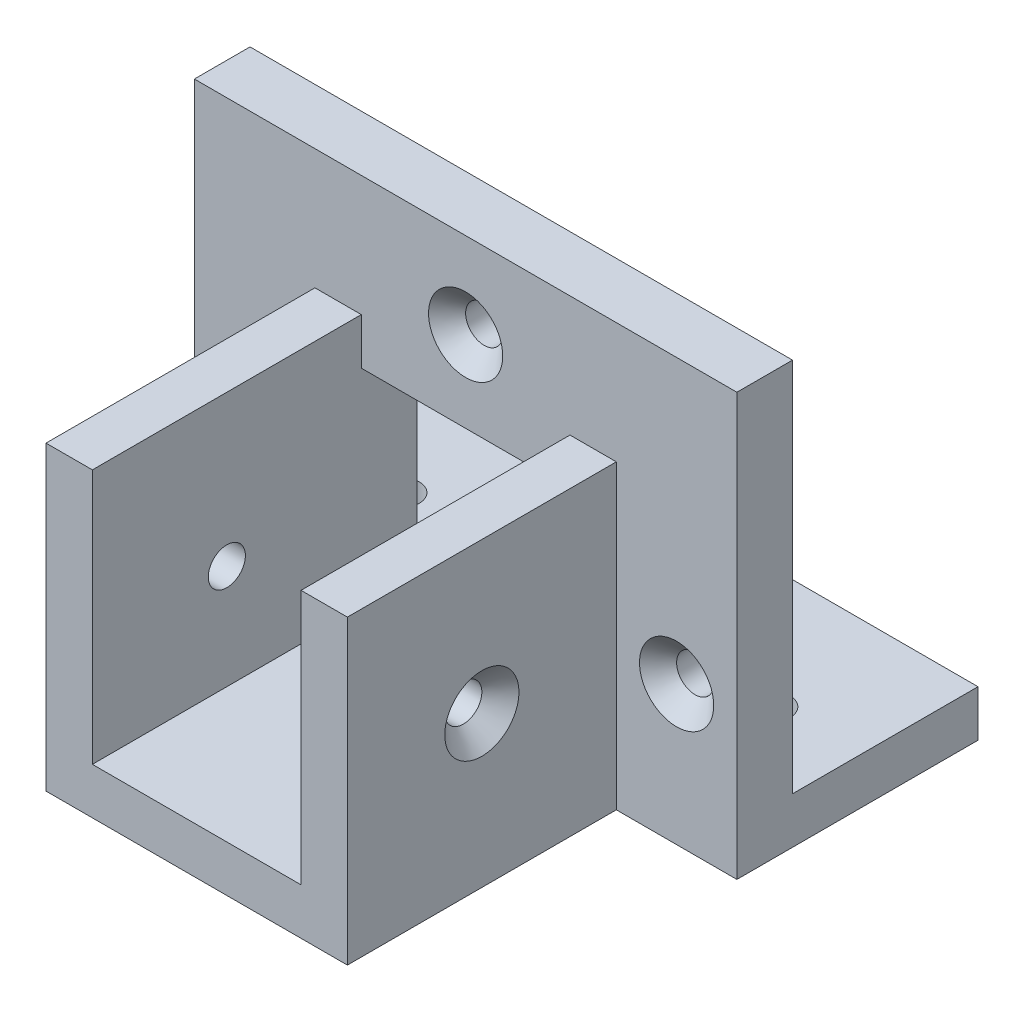
ISO-10303-21;
HEADER;
FILE_DESCRIPTION(('STEP AP214'),'2;1');
FILE_NAME('part.step','',(''),(''),'','','');
FILE_SCHEMA(('AUTOMOTIVE_DESIGN { 1 0 10303 214 1 1 1 1 }'));
ENDSEC;
DATA;
#1=APPLICATION_CONTEXT('core data for automotive mechanical design processes');
#2=APPLICATION_PROTOCOL_DEFINITION('international standard','automotive_design',2000,#1);
#3=PRODUCT_CONTEXT('',#1,'mechanical');
#4=PRODUCT('Part','Part','',(#3));
#5=PRODUCT_RELATED_PRODUCT_CATEGORY('part','',(#4));
#6=PRODUCT_DEFINITION_FORMATION('','',#4);
#7=PRODUCT_DEFINITION_CONTEXT('part definition',#1,'design');
#8=PRODUCT_DEFINITION('design','',#6,#7);
#9=PRODUCT_DEFINITION_SHAPE('','',#8);
#10=(LENGTH_UNIT() NAMED_UNIT(*) SI_UNIT(.MILLI.,.METRE.));
#11=(NAMED_UNIT(*) PLANE_ANGLE_UNIT() SI_UNIT($,.RADIAN.));
#12=(NAMED_UNIT(*) SI_UNIT($,.STERADIAN.) SOLID_ANGLE_UNIT());
#13=UNCERTAINTY_MEASURE_WITH_UNIT(LENGTH_MEASURE(1.E-05),#10,'distance_accuracy_value','');
#14=(GEOMETRIC_REPRESENTATION_CONTEXT(3) GLOBAL_UNCERTAINTY_ASSIGNED_CONTEXT((#13)) GLOBAL_UNIT_ASSIGNED_CONTEXT((#10,
#11,#12)) REPRESENTATION_CONTEXT('',''));
#15=CARTESIAN_POINT('',(0.,0.,0.));
#16=DIRECTION('',(0.,0.,1.));
#17=DIRECTION('',(1.,0.,0.));
#18=AXIS2_PLACEMENT_3D('',#15,#16,#17);
#19=CARTESIAN_POINT('',(-16.25,16.25,35.));
#20=DIRECTION('',(0.,-1.,0.));
#21=DIRECTION('',(0.,0.,-1.));
#22=AXIS2_PLACEMENT_3D('',#19,#20,#21);
#23=PLANE('',#22);
#24=DIRECTION('',(-1.,0.,0.));
#25=VECTOR('',#24,1.);
#26=CARTESIAN_POINT('',(-16.25,16.25,35.));
#27=LINE('',#26,#25);
#28=CARTESIAN_POINT('',(-11.25,16.25,35.));
#29=VERTEX_POINT('',#28);
#30=CARTESIAN_POINT('',(-16.25,16.25,35.));
#31=VERTEX_POINT('',#30);
#32=EDGE_CURVE('E308',#29,#31,#27,.T.);
#33=ORIENTED_EDGE('',*,*,#32,.F.);
#34=DIRECTION('',(0.,0.,1.));
#35=VECTOR('',#34,1.);
#36=CARTESIAN_POINT('',(-11.25,16.25,-17.0488611432322));
#37=LINE('',#36,#35);
#38=CARTESIAN_POINT('',(-11.25,16.25,6.));
#39=VERTEX_POINT('',#38);
#40=EDGE_CURVE('E188',#39,#29,#37,.T.);
#41=ORIENTED_EDGE('',*,*,#40,.F.);
#42=DIRECTION('',(-1.,0.,0.));
#43=VECTOR('',#42,1.);
#44=CARTESIAN_POINT('',(16.25,16.25,6.));
#45=LINE('',#44,#43);
#46=CARTESIAN_POINT('',(-16.25,16.25,6.));
#47=VERTEX_POINT('',#46);
#48=EDGE_CURVE('E222',#39,#47,#45,.T.);
#49=ORIENTED_EDGE('',*,*,#48,.T.);
#50=DIRECTION('',(0.,0.,-1.));
#51=VECTOR('',#50,1.);
#52=CARTESIAN_POINT('',(-16.25,16.25,35.));
#53=LINE('',#52,#51);
#54=EDGE_CURVE('E327',#31,#47,#53,.T.);
#55=ORIENTED_EDGE('',*,*,#54,.F.);
#56=EDGE_LOOP('',(#33,#41,#49,#55));
#57=FACE_BOUND('',#56,.T.);
#58=ADVANCED_FACE('F41',(#57),#23,.F.);
#59=CARTESIAN_POINT('',(-11.25,11.25,35.));
#60=DIRECTION('',(0.,-1.,0.));
#61=DIRECTION('',(0.,0.,-1.));
#62=AXIS2_PLACEMENT_3D('',#59,#60,#61);
#63=PLANE('',#62);
#64=DIRECTION('',(0.,0.,-1.));
#65=VECTOR('',#64,1.);
#66=CARTESIAN_POINT('',(11.25,11.25,35.));
#67=LINE('',#66,#65);
#68=CARTESIAN_POINT('',(11.25,11.25,5.99999999999999));
#69=VERTEX_POINT('',#68);
#70=CARTESIAN_POINT('',(11.25,11.25,0.));
#71=VERTEX_POINT('',#70);
#72=EDGE_CURVE('E295',#69,#71,#67,.T.);
#73=ORIENTED_EDGE('',*,*,#72,.F.);
#74=DIRECTION('',(-1.,0.,0.));
#75=VECTOR('',#74,1.);
#76=CARTESIAN_POINT('',(-11.25,11.25,6.));
#77=LINE('',#76,#75);
#78=CARTESIAN_POINT('',(-11.25,11.25,6.));
#79=VERTEX_POINT('',#78);
#80=EDGE_CURVE('E199',#69,#79,#77,.T.);
#81=ORIENTED_EDGE('',*,*,#80,.T.);
#82=DIRECTION('',(0.,0.,-1.));
#83=VECTOR('',#82,1.);
#84=CARTESIAN_POINT('',(-11.25,11.25,35.));
#85=LINE('',#84,#83);
#86=CARTESIAN_POINT('',(-11.25,11.25,0.));
#87=VERTEX_POINT('',#86);
#88=EDGE_CURVE('E283',#79,#87,#85,.T.);
#89=ORIENTED_EDGE('',*,*,#88,.T.);
#90=DIRECTION('',(-1.,0.,0.));
#91=VECTOR('',#90,1.);
#92=CARTESIAN_POINT('',(-11.25,11.25,0.));
#93=LINE('',#92,#91);
#94=EDGE_CURVE('E277',#71,#87,#93,.T.);
#95=ORIENTED_EDGE('',*,*,#94,.F.);
#96=EDGE_LOOP('',(#73,#81,#89,#95));
#97=FACE_BOUND('',#96,.T.);
#98=ADVANCED_FACE('F430',(#97),#63,.T.);
#99=CARTESIAN_POINT('',(0.,0.,35.));
#100=DIRECTION('',(0.,0.,-1.));
#101=DIRECTION('',(-1.,0.,0.));
#102=AXIS2_PLACEMENT_3D('',#99,#100,#101);
#103=PLANE('',#102);
#104=DIRECTION('',(0.,-1.,0.));
#105=VECTOR('',#104,1.);
#106=CARTESIAN_POINT('',(-11.25,-11.25,35.));
#107=LINE('',#106,#105);
#108=CARTESIAN_POINT('',(-11.25,-11.25,35.));
#109=VERTEX_POINT('',#108);
#110=EDGE_CURVE('E273',#29,#109,#107,.T.);
#111=ORIENTED_EDGE('',*,*,#110,.F.);
#112=ORIENTED_EDGE('',*,*,#32,.T.);
#113=DIRECTION('',(0.,-1.,0.));
#114=VECTOR('',#113,1.);
#115=CARTESIAN_POINT('',(-16.25,-16.25,35.));
#116=LINE('',#115,#114);
#117=CARTESIAN_POINT('',(-16.25,-16.25,35.));
#118=VERTEX_POINT('',#117);
#119=EDGE_CURVE('E313',#31,#118,#116,.T.);
#120=ORIENTED_EDGE('',*,*,#119,.T.);
#121=DIRECTION('',(1.,0.,0.));
#122=VECTOR('',#121,1.);
#123=CARTESIAN_POINT('',(-16.25,-16.25,35.));
#124=LINE('',#123,#122);
#125=CARTESIAN_POINT('',(16.25,-16.25,35.));
#126=VERTEX_POINT('',#125);
#127=EDGE_CURVE('E316',#118,#126,#124,.T.);
#128=ORIENTED_EDGE('',*,*,#127,.T.);
#129=DIRECTION('',(0.,1.,0.));
#130=VECTOR('',#129,1.);
#131=CARTESIAN_POINT('',(16.25,-16.25,35.));
#132=LINE('',#131,#130);
#133=CARTESIAN_POINT('',(16.25,16.25,35.));
#134=VERTEX_POINT('',#133);
#135=EDGE_CURVE('E304',#126,#134,#132,.T.);
#136=ORIENTED_EDGE('',*,*,#135,.T.);
#137=CARTESIAN_POINT('',(11.25,16.25,35.));
#138=VERTEX_POINT('',#137);
#139=EDGE_CURVE('E309',#134,#138,#27,.T.);
#140=ORIENTED_EDGE('',*,*,#139,.T.);
#141=DIRECTION('',(0.,1.,0.));
#142=VECTOR('',#141,1.);
#143=CARTESIAN_POINT('',(11.25,-11.25,35.));
#144=LINE('',#143,#142);
#145=CARTESIAN_POINT('',(11.25,-11.25,35.));
#146=VERTEX_POINT('',#145);
#147=EDGE_CURVE('E280',#146,#138,#144,.T.);
#148=ORIENTED_EDGE('',*,*,#147,.F.);
#149=DIRECTION('',(1.,0.,0.));
#150=VECTOR('',#149,1.);
#151=CARTESIAN_POINT('',(-11.25,-11.25,35.));
#152=LINE('',#151,#150);
#153=EDGE_CURVE('E276',#109,#146,#152,.T.);
#154=ORIENTED_EDGE('',*,*,#153,.F.);
#155=EDGE_LOOP('',(#111,#112,#120,#128,#136,#140,#148,#154));
#156=FACE_BOUND('',#155,.T.);
#157=ADVANCED_FACE('F437',(#156),#103,.F.);
#158=CARTESIAN_POINT('',(0.,0.,0.));
#159=DIRECTION('',(0.,0.,-1.));
#160=DIRECTION('',(-1.,0.,0.));
#161=AXIS2_PLACEMENT_3D('',#158,#159,#160);
#162=PLANE('',#161);
#163=DIRECTION('',(1.,0.,0.));
#164=VECTOR('',#163,1.);
#165=CARTESIAN_POINT('',(-29.25,-11.25,0.));
#166=LINE('',#165,#164);
#167=CARTESIAN_POINT('',(-29.25,-11.25,0.));
#168=VERTEX_POINT('',#167);
#169=CARTESIAN_POINT('',(-11.25,-11.25,0.));
#170=VERTEX_POINT('',#169);
#171=EDGE_CURVE('E58',#168,#170,#166,.T.);
#172=ORIENTED_EDGE('',*,*,#171,.F.);
#173=DIRECTION('',(0.,1.,0.));
#174=VECTOR('',#173,1.);
#175=CARTESIAN_POINT('',(-29.25,29.25,0.));
#176=LINE('',#175,#174);
#177=CARTESIAN_POINT('',(-29.25,29.25,0.));
#178=VERTEX_POINT('',#177);
#179=EDGE_CURVE('E183',#168,#178,#176,.T.);
#180=ORIENTED_EDGE('',*,*,#179,.T.);
#181=DIRECTION('',(1.,0.,0.));
#182=VECTOR('',#181,1.);
#183=CARTESIAN_POINT('',(29.25,29.25,0.));
#184=LINE('',#183,#182);
#185=CARTESIAN_POINT('',(29.25,29.25,0.));
#186=VERTEX_POINT('',#185);
#187=EDGE_CURVE('E255',#178,#186,#184,.T.);
#188=ORIENTED_EDGE('',*,*,#187,.T.);
#189=DIRECTION('',(0.,-1.,0.));
#190=VECTOR('',#189,1.);
#191=CARTESIAN_POINT('',(29.25,-16.25,0.));
#192=LINE('',#191,#190);
#193=CARTESIAN_POINT('',(29.25,-11.25,0.));
#194=VERTEX_POINT('',#193);
#195=EDGE_CURVE('E223',#186,#194,#192,.T.);
#196=ORIENTED_EDGE('',*,*,#195,.T.);
#197=CARTESIAN_POINT('',(11.25,-11.25,0.));
#198=VERTEX_POINT('',#197);
#199=EDGE_CURVE('E335',#198,#194,#166,.T.);
#200=ORIENTED_EDGE('',*,*,#199,.F.);
#201=DIRECTION('',(0.,1.,0.));
#202=VECTOR('',#201,1.);
#203=CARTESIAN_POINT('',(11.25,-11.25,0.));
#204=LINE('',#203,#202);
#205=EDGE_CURVE('E286',#198,#71,#204,.T.);
#206=ORIENTED_EDGE('',*,*,#205,.T.);
#207=ORIENTED_EDGE('',*,*,#94,.T.);
#208=DIRECTION('',(0.,-1.,0.));
#209=VECTOR('',#208,1.);
#210=CARTESIAN_POINT('',(-11.25,-11.25,0.));
#211=LINE('',#210,#209);
#212=EDGE_CURVE('E264',#87,#170,#211,.T.);
#213=ORIENTED_EDGE('',*,*,#212,.T.);
#214=EDGE_LOOP('',(#172,#180,#188,#196,#200,#206,#207,#213));
#215=FACE_BOUND('',#214,.T.);
#216=CARTESIAN_POINT('',(-22.75,-1.25000000000001,0.));
#217=DIRECTION('',(0.,0.,1.));
#218=DIRECTION('',(1.,0.,0.));
#219=AXIS2_PLACEMENT_3D('',#216,#217,#218);
#220=CIRCLE('',#219,2.);
#221=CARTESIAN_POINT('',(-20.75,-1.25000000000001,0.));
#222=VERTEX_POINT('',#221);
#223=EDGE_CURVE('E207',#222,#222,#220,.T.);
#224=ORIENTED_EDGE('',*,*,#223,.T.);
#225=EDGE_LOOP('',(#224));
#226=FACE_BOUND('',#225,.T.);
#227=CARTESIAN_POINT('',(0.,20.,0.));
#228=DIRECTION('',(0.,0.,1.));
#229=DIRECTION('',(1.,0.,0.));
#230=AXIS2_PLACEMENT_3D('',#227,#228,#229);
#231=CIRCLE('',#230,2.);
#232=CARTESIAN_POINT('',(2.,20.,0.));
#233=VERTEX_POINT('',#232);
#234=EDGE_CURVE('E211',#233,#233,#231,.T.);
#235=ORIENTED_EDGE('',*,*,#234,.T.);
#236=EDGE_LOOP('',(#235));
#237=FACE_BOUND('',#236,.T.);
#238=CARTESIAN_POINT('',(22.75,-1.25,0.));
#239=DIRECTION('',(0.,0.,1.));
#240=DIRECTION('',(1.,0.,0.));
#241=AXIS2_PLACEMENT_3D('',#238,#239,#240);
#242=CIRCLE('',#241,2.);
#243=CARTESIAN_POINT('',(24.75,-1.25,0.));
#244=VERTEX_POINT('',#243);
#245=EDGE_CURVE('E206',#244,#244,#242,.T.);
#246=ORIENTED_EDGE('',*,*,#245,.T.);
#247=EDGE_LOOP('',(#246));
#248=FACE_BOUND('',#247,.T.);
#249=ADVANCED_FACE('F453',(#215,#226,#237,#248),#162,.T.);
#250=CARTESIAN_POINT('',(16.25,-16.25,35.));
#251=DIRECTION('',(-1.,0.,0.));
#252=DIRECTION('',(0.,0.,1.));
#253=AXIS2_PLACEMENT_3D('',#250,#251,#252);
#254=PLANE('',#253);
#255=CARTESIAN_POINT('',(16.25,0.,20.5));
#256=DIRECTION('',(-1.,0.,0.));
#257=DIRECTION('',(0.,0.,1.));
#258=AXIS2_PLACEMENT_3D('',#255,#256,#257);
#259=CIRCLE('',#258,4.00000000000002);
#260=CARTESIAN_POINT('',(16.25,0.,24.5));
#261=VERTEX_POINT('',#260);
#262=EDGE_CURVE('E365',#261,#261,#259,.T.);
#263=ORIENTED_EDGE('',*,*,#262,.T.);
#264=EDGE_LOOP('',(#263));
#265=FACE_BOUND('',#264,.T.);
#266=DIRECTION('',(0.,0.,-1.));
#267=VECTOR('',#266,1.);
#268=CARTESIAN_POINT('',(16.25,-16.25,35.));
#269=LINE('',#268,#267);
#270=CARTESIAN_POINT('',(16.25,-16.25,6.));
#271=VERTEX_POINT('',#270);
#272=EDGE_CURVE('E319',#126,#271,#269,.T.);
#273=ORIENTED_EDGE('',*,*,#272,.T.);
#274=DIRECTION('',(0.,1.,0.));
#275=VECTOR('',#274,1.);
#276=CARTESIAN_POINT('',(16.25,-16.25,6.));
#277=LINE('',#276,#275);
#278=CARTESIAN_POINT('',(16.25,16.25,6.));
#279=VERTEX_POINT('',#278);
#280=EDGE_CURVE('E218',#271,#279,#277,.T.);
#281=ORIENTED_EDGE('',*,*,#280,.T.);
#282=DIRECTION('',(0.,0.,-1.));
#283=VECTOR('',#282,1.);
#284=CARTESIAN_POINT('',(16.25,16.25,35.));
#285=LINE('',#284,#283);
#286=EDGE_CURVE('E331',#134,#279,#285,.T.);
#287=ORIENTED_EDGE('',*,*,#286,.F.);
#288=ORIENTED_EDGE('',*,*,#135,.F.);
#289=EDGE_LOOP('',(#273,#281,#287,#288));
#290=FACE_BOUND('',#289,.T.);
#291=ADVANCED_FACE('F445',(#265,#290),#254,.F.);
#292=CARTESIAN_POINT('',(11.25,16.25,6.));
#293=VERTEX_POINT('',#292);
#294=EDGE_CURVE('E224',#279,#293,#45,.T.);
#295=ORIENTED_EDGE('',*,*,#294,.T.);
#296=DIRECTION('',(0.,0.,1.));
#297=VECTOR('',#296,1.);
#298=CARTESIAN_POINT('',(11.25,16.25,-17.0488611432322));
#299=LINE('',#298,#297);
#300=EDGE_CURVE('E66',#293,#138,#299,.T.);
#301=ORIENTED_EDGE('',*,*,#300,.T.);
#302=ORIENTED_EDGE('',*,*,#139,.F.);
#303=ORIENTED_EDGE('',*,*,#286,.T.);
#304=EDGE_LOOP('',(#295,#301,#302,#303));
#305=FACE_BOUND('',#304,.T.);
#306=ADVANCED_FACE('F433',(#305),#23,.F.);
#307=CARTESIAN_POINT('',(-16.25,-16.25,35.));
#308=DIRECTION('',(1.,0.,0.));
#309=DIRECTION('',(0.,0.,-1.));
#310=AXIS2_PLACEMENT_3D('',#307,#308,#309);
#311=PLANE('',#310);
#312=CARTESIAN_POINT('',(-16.25,0.,20.5));
#313=DIRECTION('',(1.,0.,0.));
#314=DIRECTION('',(0.,0.,-1.));
#315=AXIS2_PLACEMENT_3D('',#312,#313,#314);
#316=CIRCLE('',#315,4.);
#317=CARTESIAN_POINT('',(-16.25,0.,16.5));
#318=VERTEX_POINT('',#317);
#319=EDGE_CURVE('E353',#318,#318,#316,.T.);
#320=ORIENTED_EDGE('',*,*,#319,.T.);
#321=EDGE_LOOP('',(#320));
#322=FACE_BOUND('',#321,.T.);
#323=ORIENTED_EDGE('',*,*,#54,.T.);
#324=DIRECTION('',(0.,-1.,0.));
#325=VECTOR('',#324,1.);
#326=CARTESIAN_POINT('',(-16.25,16.25,6.));
#327=LINE('',#326,#325);
#328=CARTESIAN_POINT('',(-16.25,-16.25,6.));
#329=VERTEX_POINT('',#328);
#330=EDGE_CURVE('E228',#47,#329,#327,.T.);
#331=ORIENTED_EDGE('',*,*,#330,.T.);
#332=DIRECTION('',(0.,0.,-1.));
#333=VECTOR('',#332,1.);
#334=CARTESIAN_POINT('',(-16.25,-16.25,35.));
#335=LINE('',#334,#333);
#336=EDGE_CURVE('E323',#118,#329,#335,.T.);
#337=ORIENTED_EDGE('',*,*,#336,.F.);
#338=ORIENTED_EDGE('',*,*,#119,.F.);
#339=EDGE_LOOP('',(#323,#331,#337,#338));
#340=FACE_BOUND('',#339,.T.);
#341=ADVANCED_FACE('F444',(#322,#340),#311,.F.);
#342=CARTESIAN_POINT('',(-16.25,-16.25,35.));
#343=DIRECTION('',(0.,1.,0.));
#344=DIRECTION('',(0.,0.,1.));
#345=AXIS2_PLACEMENT_3D('',#342,#343,#344);
#346=PLANE('',#345);
#347=CARTESIAN_POINT('',(20.,-16.25,-7.));
#348=DIRECTION('',(0.,1.,0.));
#349=DIRECTION('',(0.,0.,1.));
#350=AXIS2_PLACEMENT_3D('',#347,#348,#349);
#351=CIRCLE('',#350,4.00000000000002);
#352=CARTESIAN_POINT('',(20.,-16.25,-2.99999999999998));
#353=VERTEX_POINT('',#352);
#354=EDGE_CURVE('E381',#353,#353,#351,.T.);
#355=ORIENTED_EDGE('',*,*,#354,.T.);
#356=EDGE_LOOP('',(#355));
#357=FACE_BOUND('',#356,.T.);
#358=CARTESIAN_POINT('',(0.,-16.25,20.5));
#359=DIRECTION('',(0.,1.,0.));
#360=DIRECTION('',(0.,0.,1.));
#361=AXIS2_PLACEMENT_3D('',#358,#359,#360);
#362=CIRCLE('',#361,4.00000000000002);
#363=CARTESIAN_POINT('',(0.,-16.25,24.5));
#364=VERTEX_POINT('',#363);
#365=EDGE_CURVE('E377',#364,#364,#362,.T.);
#366=ORIENTED_EDGE('',*,*,#365,.T.);
#367=EDGE_LOOP('',(#366));
#368=FACE_BOUND('',#367,.T.);
#369=CARTESIAN_POINT('',(-20.,-16.25,-7.));
#370=DIRECTION('',(0.,1.,0.));
#371=DIRECTION('',(0.,0.,1.));
#372=AXIS2_PLACEMENT_3D('',#369,#370,#371);
#373=CIRCLE('',#372,4.00000000000002);
#374=CARTESIAN_POINT('',(-20.,-16.25,-2.99999999999998));
#375=VERTEX_POINT('',#374);
#376=EDGE_CURVE('E373',#375,#375,#373,.T.);
#377=ORIENTED_EDGE('',*,*,#376,.T.);
#378=EDGE_LOOP('',(#377));
#379=FACE_BOUND('',#378,.T.);
#380=DIRECTION('',(0.,0.,-1.));
#381=VECTOR('',#380,1.);
#382=CARTESIAN_POINT('',(-29.25,-16.25,6.));
#383=LINE('',#382,#381);
#384=CARTESIAN_POINT('',(-29.25,-16.25,6.));
#385=VERTEX_POINT('',#384);
#386=CARTESIAN_POINT('',(-29.25,-16.25,-20.));
#387=VERTEX_POINT('',#386);
#388=EDGE_CURVE('E252',#385,#387,#383,.T.);
#389=ORIENTED_EDGE('',*,*,#388,.T.);
#390=DIRECTION('',(-1.,0.,0.));
#391=VECTOR('',#390,1.);
#392=CARTESIAN_POINT('',(-29.25,-16.25,-20.));
#393=LINE('',#392,#391);
#394=CARTESIAN_POINT('',(29.25,-16.25,-20.));
#395=VERTEX_POINT('',#394);
#396=EDGE_CURVE('E177',#395,#387,#393,.T.);
#397=ORIENTED_EDGE('',*,*,#396,.F.);
#398=DIRECTION('',(0.,0.,-1.));
#399=VECTOR('',#398,1.);
#400=CARTESIAN_POINT('',(29.25,-16.25,6.));
#401=LINE('',#400,#399);
#402=CARTESIAN_POINT('',(29.25,-16.25,6.));
#403=VERTEX_POINT('',#402);
#404=EDGE_CURVE('E261',#403,#395,#401,.T.);
#405=ORIENTED_EDGE('',*,*,#404,.F.);
#406=DIRECTION('',(-1.,0.,0.));
#407=VECTOR('',#406,1.);
#408=CARTESIAN_POINT('',(16.25,-16.25,6.));
#409=LINE('',#408,#407);
#410=EDGE_CURVE('E248',#403,#271,#409,.T.);
#411=ORIENTED_EDGE('',*,*,#410,.T.);
#412=ORIENTED_EDGE('',*,*,#272,.F.);
#413=ORIENTED_EDGE('',*,*,#127,.F.);
#414=ORIENTED_EDGE('',*,*,#336,.T.);
#415=DIRECTION('',(-1.,0.,0.));
#416=VECTOR('',#415,1.);
#417=CARTESIAN_POINT('',(-29.25,-16.25,6.));
#418=LINE('',#417,#416);
#419=EDGE_CURVE('E232',#329,#385,#418,.T.);
#420=ORIENTED_EDGE('',*,*,#419,.T.);
#421=EDGE_LOOP('',(#389,#397,#405,#411,#412,#413,#414,#420));
#422=FACE_BOUND('',#421,.T.);
#423=ADVANCED_FACE('F451',(#357,#368,#379,#422),#346,.F.);
#424=CARTESIAN_POINT('',(-11.25,-11.25,35.));
#425=DIRECTION('',(1.,0.,0.));
#426=DIRECTION('',(0.,0.,-1.));
#427=AXIS2_PLACEMENT_3D('',#424,#425,#426);
#428=PLANE('',#427);
#429=CARTESIAN_POINT('',(-11.25,0.,20.5));
#430=DIRECTION('',(1.,0.,0.));
#431=DIRECTION('',(0.,0.,-1.));
#432=AXIS2_PLACEMENT_3D('',#429,#430,#431);
#433=CIRCLE('',#432,2.);
#434=CARTESIAN_POINT('',(-11.25,0.,18.5));
#435=VERTEX_POINT('',#434);
#436=EDGE_CURVE('E340',#435,#435,#433,.T.);
#437=ORIENTED_EDGE('',*,*,#436,.F.);
#438=EDGE_LOOP('',(#437));
#439=FACE_BOUND('',#438,.T.);
#440=ORIENTED_EDGE('',*,*,#212,.F.);
#441=ORIENTED_EDGE('',*,*,#88,.F.);
#442=DIRECTION('',(0.,1.,0.));
#443=VECTOR('',#442,1.);
#444=CARTESIAN_POINT('',(-11.25,11.25,6.));
#445=LINE('',#444,#443);
#446=EDGE_CURVE('E196',#79,#39,#445,.T.);
#447=ORIENTED_EDGE('',*,*,#446,.T.);
#448=ORIENTED_EDGE('',*,*,#40,.T.);
#449=ORIENTED_EDGE('',*,*,#110,.T.);
#450=DIRECTION('',(0.,0.,-1.));
#451=VECTOR('',#450,1.);
#452=CARTESIAN_POINT('',(-11.25,-11.25,35.));
#453=LINE('',#452,#451);
#454=EDGE_CURVE('E301',#109,#170,#453,.T.);
#455=ORIENTED_EDGE('',*,*,#454,.T.);
#456=EDGE_LOOP('',(#440,#441,#447,#448,#449,#455));
#457=FACE_BOUND('',#456,.T.);
#458=ADVANCED_FACE('F531',(#439,#457),#428,.T.);
#459=CARTESIAN_POINT('',(-11.25,-11.25,35.));
#460=DIRECTION('',(0.,1.,0.));
#461=DIRECTION('',(0.,0.,1.));
#462=AXIS2_PLACEMENT_3D('',#459,#460,#461);
#463=PLANE('',#462);
#464=CARTESIAN_POINT('',(-20.,-11.25,-7.));
#465=DIRECTION('',(0.,1.,0.));
#466=DIRECTION('',(0.,0.,1.));
#467=AXIS2_PLACEMENT_3D('',#464,#465,#466);
#468=CIRCLE('',#467,2.);
#469=CARTESIAN_POINT('',(-20.,-11.25,-5.));
#470=VERTEX_POINT('',#469);
#471=EDGE_CURVE('E341',#470,#470,#468,.T.);
#472=ORIENTED_EDGE('',*,*,#471,.F.);
#473=EDGE_LOOP('',(#472));
#474=FACE_BOUND('',#473,.T.);
#475=CARTESIAN_POINT('',(20.,-11.25,-7.));
#476=DIRECTION('',(0.,1.,0.));
#477=DIRECTION('',(0.,0.,1.));
#478=AXIS2_PLACEMENT_3D('',#475,#476,#477);
#479=CIRCLE('',#478,2.);
#480=CARTESIAN_POINT('',(20.,-11.25,-5.));
#481=VERTEX_POINT('',#480);
#482=EDGE_CURVE('E346',#481,#481,#479,.T.);
#483=ORIENTED_EDGE('',*,*,#482,.F.);
#484=EDGE_LOOP('',(#483));
#485=FACE_BOUND('',#484,.T.);
#486=CARTESIAN_POINT('',(0.,-11.25,20.5));
#487=DIRECTION('',(0.,1.,0.));
#488=DIRECTION('',(0.,0.,1.));
#489=AXIS2_PLACEMENT_3D('',#486,#487,#488);
#490=CIRCLE('',#489,2.);
#491=CARTESIAN_POINT('',(0.,-11.25,22.5));
#492=VERTEX_POINT('',#491);
#493=EDGE_CURVE('E342',#492,#492,#490,.T.);
#494=ORIENTED_EDGE('',*,*,#493,.F.);
#495=EDGE_LOOP('',(#494));
#496=FACE_BOUND('',#495,.T.);
#497=DIRECTION('',(0.,0.,-1.));
#498=VECTOR('',#497,1.);
#499=CARTESIAN_POINT('',(11.25,-11.25,35.));
#500=LINE('',#499,#498);
#501=EDGE_CURVE('E298',#146,#198,#500,.T.);
#502=ORIENTED_EDGE('',*,*,#501,.T.);
#503=ORIENTED_EDGE('',*,*,#199,.T.);
#504=DIRECTION('',(0.,0.,1.));
#505=VECTOR('',#504,1.);
#506=CARTESIAN_POINT('',(29.25,-11.25,-20.));
#507=LINE('',#506,#505);
#508=CARTESIAN_POINT('',(29.25,-11.25,-20.));
#509=VERTEX_POINT('',#508);
#510=EDGE_CURVE('E165',#509,#194,#507,.T.);
#511=ORIENTED_EDGE('',*,*,#510,.F.);
#512=DIRECTION('',(1.,0.,0.));
#513=VECTOR('',#512,1.);
#514=CARTESIAN_POINT('',(-29.25,-11.25,-20.));
#515=LINE('',#514,#513);
#516=CARTESIAN_POINT('',(-29.25,-11.25,-20.));
#517=VERTEX_POINT('',#516);
#518=EDGE_CURVE('E157',#517,#509,#515,.T.);
#519=ORIENTED_EDGE('',*,*,#518,.F.);
#520=DIRECTION('',(0.,0.,1.));
#521=VECTOR('',#520,1.);
#522=CARTESIAN_POINT('',(-29.25,-11.25,-20.));
#523=LINE('',#522,#521);
#524=EDGE_CURVE('E162',#517,#168,#523,.T.);
#525=ORIENTED_EDGE('',*,*,#524,.T.);
#526=ORIENTED_EDGE('',*,*,#171,.T.);
#527=ORIENTED_EDGE('',*,*,#454,.F.);
#528=ORIENTED_EDGE('',*,*,#153,.T.);
#529=EDGE_LOOP('',(#502,#503,#511,#519,#525,#526,#527,#528));
#530=FACE_BOUND('',#529,.T.);
#531=ADVANCED_FACE('F160',(#474,#485,#496,#530),#463,.T.);
#532=CARTESIAN_POINT('',(11.25,-11.25,35.));
#533=DIRECTION('',(-1.,0.,0.));
#534=DIRECTION('',(0.,0.,1.));
#535=AXIS2_PLACEMENT_3D('',#532,#533,#534);
#536=PLANE('',#535);
#537=CARTESIAN_POINT('',(11.25,0.,20.5));
#538=DIRECTION('',(-1.,0.,0.));
#539=DIRECTION('',(0.,0.,1.));
#540=AXIS2_PLACEMENT_3D('',#537,#538,#539);
#541=CIRCLE('',#540,2.);
#542=CARTESIAN_POINT('',(11.25,0.,22.5));
#543=VERTEX_POINT('',#542);
#544=EDGE_CURVE('E336',#543,#543,#541,.T.);
#545=ORIENTED_EDGE('',*,*,#544,.F.);
#546=EDGE_LOOP('',(#545));
#547=FACE_BOUND('',#546,.T.);
#548=ORIENTED_EDGE('',*,*,#205,.F.);
#549=ORIENTED_EDGE('',*,*,#501,.F.);
#550=ORIENTED_EDGE('',*,*,#147,.T.);
#551=ORIENTED_EDGE('',*,*,#300,.F.);
#552=DIRECTION('',(0.,-1.,0.));
#553=VECTOR('',#552,1.);
#554=CARTESIAN_POINT('',(11.25,11.25,6.));
#555=LINE('',#554,#553);
#556=EDGE_CURVE('E193',#293,#69,#555,.T.);
#557=ORIENTED_EDGE('',*,*,#556,.T.);
#558=ORIENTED_EDGE('',*,*,#72,.T.);
#559=EDGE_LOOP('',(#548,#549,#550,#551,#557,#558));
#560=FACE_BOUND('',#559,.T.);
#561=ADVANCED_FACE('F521',(#547,#560),#536,.T.);
#562=CARTESIAN_POINT('',(29.25,-16.25,6.));
#563=DIRECTION('',(1.,0.,0.));
#564=DIRECTION('',(0.,0.,-1.));
#565=AXIS2_PLACEMENT_3D('',#562,#563,#564);
#566=PLANE('',#565);
#567=ORIENTED_EDGE('',*,*,#195,.F.);
#568=DIRECTION('',(0.,0.,-1.));
#569=VECTOR('',#568,1.);
#570=CARTESIAN_POINT('',(29.25,29.25,6.));
#571=LINE('',#570,#569);
#572=CARTESIAN_POINT('',(29.25,29.25,6.));
#573=VERTEX_POINT('',#572);
#574=EDGE_CURVE('E265',#573,#186,#571,.T.);
#575=ORIENTED_EDGE('',*,*,#574,.F.);
#576=DIRECTION('',(0.,-1.,0.));
#577=VECTOR('',#576,1.);
#578=CARTESIAN_POINT('',(29.25,-16.25,6.));
#579=LINE('',#578,#577);
#580=EDGE_CURVE('E244',#573,#403,#579,.T.);
#581=ORIENTED_EDGE('',*,*,#580,.T.);
#582=ORIENTED_EDGE('',*,*,#404,.T.);
#583=DIRECTION('',(0.,-1.,0.));
#584=VECTOR('',#583,1.);
#585=CARTESIAN_POINT('',(29.25,-16.25,-20.));
#586=LINE('',#585,#584);
#587=EDGE_CURVE('E170',#509,#395,#586,.T.);
#588=ORIENTED_EDGE('',*,*,#587,.F.);
#589=ORIENTED_EDGE('',*,*,#510,.T.);
#590=EDGE_LOOP('',(#567,#575,#581,#582,#588,#589));
#591=FACE_BOUND('',#590,.T.);
#592=ADVANCED_FACE('F494',(#591),#566,.T.);
#593=CARTESIAN_POINT('',(29.25,29.25,6.));
#594=DIRECTION('',(0.,1.,0.));
#595=DIRECTION('',(0.,0.,1.));
#596=AXIS2_PLACEMENT_3D('',#593,#594,#595);
#597=PLANE('',#596);
#598=ORIENTED_EDGE('',*,*,#187,.F.);
#599=DIRECTION('',(0.,0.,-1.));
#600=VECTOR('',#599,1.);
#601=CARTESIAN_POINT('',(-29.25,29.25,6.));
#602=LINE('',#601,#600);
#603=CARTESIAN_POINT('',(-29.25,29.25,6.));
#604=VERTEX_POINT('',#603);
#605=EDGE_CURVE('E268',#604,#178,#602,.T.);
#606=ORIENTED_EDGE('',*,*,#605,.F.);
#607=DIRECTION('',(1.,0.,0.));
#608=VECTOR('',#607,1.);
#609=CARTESIAN_POINT('',(29.25,29.25,6.));
#610=LINE('',#609,#608);
#611=EDGE_CURVE('E240',#604,#573,#610,.T.);
#612=ORIENTED_EDGE('',*,*,#611,.T.);
#613=ORIENTED_EDGE('',*,*,#574,.T.);
#614=EDGE_LOOP('',(#598,#606,#612,#613));
#615=FACE_BOUND('',#614,.T.);
#616=ADVANCED_FACE('F471',(#615),#597,.T.);
#617=CARTESIAN_POINT('',(-29.25,29.25,6.));
#618=DIRECTION('',(-1.,0.,0.));
#619=DIRECTION('',(0.,0.,1.));
#620=AXIS2_PLACEMENT_3D('',#617,#618,#619);
#621=PLANE('',#620);
#622=ORIENTED_EDGE('',*,*,#179,.F.);
#623=ORIENTED_EDGE('',*,*,#524,.F.);
#624=DIRECTION('',(0.,1.,0.));
#625=VECTOR('',#624,1.);
#626=CARTESIAN_POINT('',(-29.25,-16.25,-20.));
#627=LINE('',#626,#625);
#628=EDGE_CURVE('E171',#387,#517,#627,.T.);
#629=ORIENTED_EDGE('',*,*,#628,.F.);
#630=ORIENTED_EDGE('',*,*,#388,.F.);
#631=DIRECTION('',(0.,1.,0.));
#632=VECTOR('',#631,1.);
#633=CARTESIAN_POINT('',(-29.25,29.25,6.));
#634=LINE('',#633,#632);
#635=EDGE_CURVE('E236',#385,#604,#634,.T.);
#636=ORIENTED_EDGE('',*,*,#635,.T.);
#637=ORIENTED_EDGE('',*,*,#605,.T.);
#638=EDGE_LOOP('',(#622,#623,#629,#630,#636,#637));
#639=FACE_BOUND('',#638,.T.);
#640=ADVANCED_FACE('F181',(#639),#621,.T.);
#641=CARTESIAN_POINT('',(0.,0.,6.));
#642=DIRECTION('',(0.,0.,1.));
#643=DIRECTION('',(1.,0.,0.));
#644=AXIS2_PLACEMENT_3D('',#641,#642,#643);
#645=PLANE('',#644);
#646=CARTESIAN_POINT('',(0.,20.,6.));
#647=DIRECTION('',(0.,0.,1.));
#648=DIRECTION('',(1.,0.,0.));
#649=AXIS2_PLACEMENT_3D('',#646,#647,#648);
#650=CIRCLE('',#649,4.00000000000003);
#651=CARTESIAN_POINT('',(4.00000000000003,20.,6.));
#652=VERTEX_POINT('',#651);
#653=EDGE_CURVE('E405',#652,#652,#650,.F.);
#654=ORIENTED_EDGE('',*,*,#653,.T.);
#655=EDGE_LOOP('',(#654));
#656=FACE_BOUND('',#655,.T.);
#657=CARTESIAN_POINT('',(-22.75,-1.25000000000001,6.));
#658=DIRECTION('',(0.,0.,1.));
#659=DIRECTION('',(1.,0.,0.));
#660=AXIS2_PLACEMENT_3D('',#657,#658,#659);
#661=CIRCLE('',#660,4.00000000000003);
#662=CARTESIAN_POINT('',(-18.75,-1.25000000000001,6.));
#663=VERTEX_POINT('',#662);
#664=EDGE_CURVE('E401',#663,#663,#661,.F.);
#665=ORIENTED_EDGE('',*,*,#664,.T.);
#666=EDGE_LOOP('',(#665));
#667=FACE_BOUND('',#666,.T.);
#668=CARTESIAN_POINT('',(22.75,-1.25,6.));
#669=DIRECTION('',(0.,0.,1.));
#670=DIRECTION('',(1.,0.,0.));
#671=AXIS2_PLACEMENT_3D('',#668,#669,#670);
#672=CIRCLE('',#671,4.00000000000003);
#673=CARTESIAN_POINT('',(26.75,-1.25,6.));
#674=VERTEX_POINT('',#673);
#675=EDGE_CURVE('E397',#674,#674,#672,.F.);
#676=ORIENTED_EDGE('',*,*,#675,.T.);
#677=EDGE_LOOP('',(#676));
#678=FACE_BOUND('',#677,.T.);
#679=ORIENTED_EDGE('',*,*,#280,.F.);
#680=ORIENTED_EDGE('',*,*,#410,.F.);
#681=ORIENTED_EDGE('',*,*,#580,.F.);
#682=ORIENTED_EDGE('',*,*,#611,.F.);
#683=ORIENTED_EDGE('',*,*,#635,.F.);
#684=ORIENTED_EDGE('',*,*,#419,.F.);
#685=ORIENTED_EDGE('',*,*,#330,.F.);
#686=ORIENTED_EDGE('',*,*,#48,.F.);
#687=ORIENTED_EDGE('',*,*,#446,.F.);
#688=ORIENTED_EDGE('',*,*,#80,.F.);
#689=ORIENTED_EDGE('',*,*,#556,.F.);
#690=ORIENTED_EDGE('',*,*,#294,.F.);
#691=EDGE_LOOP('',(#679,#680,#681,#682,#683,#684,#685,#686,#687,#688,#689,#690));
#692=FACE_BOUND('',#691,.T.);
#693=ADVANCED_FACE('F457',(#656,#667,#678,#692),#645,.T.);
#694=CARTESIAN_POINT('',(22.75,-1.25,0.));
#695=DIRECTION('',(0.,0.,1.));
#696=DIRECTION('',(1.,0.,0.));
#697=AXIS2_PLACEMENT_3D('',#694,#695,#696);
#698=CYLINDRICAL_SURFACE('',#697,2.);
#699=CARTESIAN_POINT('',(22.75,-1.25,3.99999999999999));
#700=DIRECTION('',(0.,0.,1.));
#701=DIRECTION('',(1.,0.,0.));
#702=AXIS2_PLACEMENT_3D('',#699,#700,#701);
#703=CIRCLE('',#702,2.);
#704=CARTESIAN_POINT('',(24.75,-1.25,3.99999999999999));
#705=VERTEX_POINT('',#704);
#706=EDGE_CURVE('E11',#705,#705,#703,.T.);
#707=ORIENTED_EDGE('',*,*,#706,.T.);
#708=EDGE_LOOP('',(#707));
#709=FACE_BOUND('',#708,.T.);
#710=ORIENTED_EDGE('',*,*,#245,.F.);
#711=EDGE_LOOP('',(#710));
#712=FACE_BOUND('',#711,.T.);
#713=ADVANCED_FACE('F504',(#709,#712),#698,.F.);
#714=CARTESIAN_POINT('',(0.,20.,0.));
#715=DIRECTION('',(0.,0.,1.));
#716=DIRECTION('',(1.,0.,0.));
#717=AXIS2_PLACEMENT_3D('',#714,#715,#716);
#718=CYLINDRICAL_SURFACE('',#717,2.);
#719=CARTESIAN_POINT('',(0.,20.,3.99999999999999));
#720=DIRECTION('',(0.,0.,1.));
#721=DIRECTION('',(1.,0.,0.));
#722=AXIS2_PLACEMENT_3D('',#719,#720,#721);
#723=CIRCLE('',#722,2.);
#724=CARTESIAN_POINT('',(2.,20.,3.99999999999999));
#725=VERTEX_POINT('',#724);
#726=EDGE_CURVE('E393',#725,#725,#723,.T.);
#727=ORIENTED_EDGE('',*,*,#726,.T.);
#728=EDGE_LOOP('',(#727));
#729=FACE_BOUND('',#728,.T.);
#730=ORIENTED_EDGE('',*,*,#234,.F.);
#731=EDGE_LOOP('',(#730));
#732=FACE_BOUND('',#731,.T.);
#733=ADVANCED_FACE('F506',(#729,#732),#718,.F.);
#734=CARTESIAN_POINT('',(-22.75,-1.25000000000001,0.));
#735=DIRECTION('',(0.,0.,1.));
#736=DIRECTION('',(1.,0.,0.));
#737=AXIS2_PLACEMENT_3D('',#734,#735,#736);
#738=CYLINDRICAL_SURFACE('',#737,2.);
#739=CARTESIAN_POINT('',(-22.75,-1.25000000000001,3.99999999999999));
#740=DIRECTION('',(0.,0.,1.));
#741=DIRECTION('',(1.,0.,0.));
#742=AXIS2_PLACEMENT_3D('',#739,#740,#741);
#743=CIRCLE('',#742,2.);
#744=CARTESIAN_POINT('',(-20.75,-1.25000000000001,3.99999999999999));
#745=VERTEX_POINT('',#744);
#746=EDGE_CURVE('E51',#745,#745,#743,.T.);
#747=ORIENTED_EDGE('',*,*,#746,.T.);
#748=EDGE_LOOP('',(#747));
#749=FACE_BOUND('',#748,.T.);
#750=ORIENTED_EDGE('',*,*,#223,.F.);
#751=EDGE_LOOP('',(#750));
#752=FACE_BOUND('',#751,.T.);
#753=ADVANCED_FACE('F412',(#749,#752),#738,.F.);
#754=CARTESIAN_POINT('',(0.,0.,-20.));
#755=DIRECTION('',(0.,0.,-1.));
#756=DIRECTION('',(-1.,0.,0.));
#757=AXIS2_PLACEMENT_3D('',#754,#755,#756);
#758=PLANE('',#757);
#759=ORIENTED_EDGE('',*,*,#628,.T.);
#760=ORIENTED_EDGE('',*,*,#518,.T.);
#761=ORIENTED_EDGE('',*,*,#587,.T.);
#762=ORIENTED_EDGE('',*,*,#396,.T.);
#763=EDGE_LOOP('',(#759,#760,#761,#762));
#764=FACE_BOUND('',#763,.T.);
#765=ADVANCED_FACE('F175',(#764),#758,.T.);
#766=CARTESIAN_POINT('',(-29.25,0.,20.5));
#767=DIRECTION('',(1.,0.,0.));
#768=DIRECTION('',(0.,0.,-1.));
#769=AXIS2_PLACEMENT_3D('',#766,#767,#768);
#770=CYLINDRICAL_SURFACE('',#769,2.);
#771=CARTESIAN_POINT('',(14.25,0.,20.5));
#772=DIRECTION('',(-1.,0.,0.));
#773=DIRECTION('',(0.,0.,1.));
#774=AXIS2_PLACEMENT_3D('',#771,#772,#773);
#775=CIRCLE('',#774,2.);
#776=CARTESIAN_POINT('',(14.25,0.,22.5));
#777=VERTEX_POINT('',#776);
#778=EDGE_CURVE('E361',#777,#777,#775,.F.);
#779=ORIENTED_EDGE('',*,*,#778,.T.);
#780=EDGE_LOOP('',(#779));
#781=FACE_BOUND('',#780,.T.);
#782=ORIENTED_EDGE('',*,*,#544,.T.);
#783=EDGE_LOOP('',(#782));
#784=FACE_BOUND('',#783,.T.);
#785=ADVANCED_FACE('F578',(#781,#784),#770,.F.);
#786=CARTESIAN_POINT('',(-14.25,0.,20.5));
#787=DIRECTION('',(1.,0.,0.));
#788=DIRECTION('',(0.,0.,-1.));
#789=AXIS2_PLACEMENT_3D('',#786,#787,#788);
#790=CIRCLE('',#789,2.);
#791=CARTESIAN_POINT('',(-14.25,0.,18.5));
#792=VERTEX_POINT('',#791);
#793=EDGE_CURVE('E357',#792,#792,#790,.F.);
#794=ORIENTED_EDGE('',*,*,#793,.T.);
#795=EDGE_LOOP('',(#794));
#796=FACE_BOUND('',#795,.T.);
#797=ORIENTED_EDGE('',*,*,#436,.T.);
#798=EDGE_LOOP('',(#797));
#799=FACE_BOUND('',#798,.T.);
#800=ADVANCED_FACE('F569',(#796,#799),#770,.F.);
#801=CARTESIAN_POINT('',(0.,29.25,20.5));
#802=DIRECTION('',(0.,-1.,0.));
#803=DIRECTION('',(0.,0.,-1.));
#804=AXIS2_PLACEMENT_3D('',#801,#802,#803);
#805=CYLINDRICAL_SURFACE('',#804,2.);
#806=CARTESIAN_POINT('',(0.,-14.25,20.5));
#807=DIRECTION('',(0.,1.,0.));
#808=DIRECTION('',(0.,0.,1.));
#809=AXIS2_PLACEMENT_3D('',#806,#807,#808);
#810=CIRCLE('',#809,2.);
#811=CARTESIAN_POINT('',(0.,-14.25,22.5));
#812=VERTEX_POINT('',#811);
#813=EDGE_CURVE('E385',#812,#812,#810,.F.);
#814=ORIENTED_EDGE('',*,*,#813,.T.);
#815=EDGE_LOOP('',(#814));
#816=FACE_BOUND('',#815,.T.);
#817=ORIENTED_EDGE('',*,*,#493,.T.);
#818=EDGE_LOOP('',(#817));
#819=FACE_BOUND('',#818,.T.);
#820=ADVANCED_FACE('F567',(#816,#819),#805,.F.);
#821=CARTESIAN_POINT('',(20.,29.25,-7.));
#822=DIRECTION('',(0.,-1.,0.));
#823=DIRECTION('',(0.,0.,-1.));
#824=AXIS2_PLACEMENT_3D('',#821,#822,#823);
#825=CYLINDRICAL_SURFACE('',#824,2.);
#826=CARTESIAN_POINT('',(20.,-14.25,-7.));
#827=DIRECTION('',(0.,1.,0.));
#828=DIRECTION('',(0.,0.,1.));
#829=AXIS2_PLACEMENT_3D('',#826,#827,#828);
#830=CIRCLE('',#829,2.);
#831=CARTESIAN_POINT('',(20.,-14.25,-5.));
#832=VERTEX_POINT('',#831);
#833=EDGE_CURVE('E369',#832,#832,#830,.F.);
#834=ORIENTED_EDGE('',*,*,#833,.T.);
#835=EDGE_LOOP('',(#834));
#836=FACE_BOUND('',#835,.T.);
#837=ORIENTED_EDGE('',*,*,#482,.T.);
#838=EDGE_LOOP('',(#837));
#839=FACE_BOUND('',#838,.T.);
#840=ADVANCED_FACE('F559',(#836,#839),#825,.F.);
#841=CARTESIAN_POINT('',(-20.,29.25,-7.));
#842=DIRECTION('',(0.,-1.,0.));
#843=DIRECTION('',(0.,0.,-1.));
#844=AXIS2_PLACEMENT_3D('',#841,#842,#843);
#845=CYLINDRICAL_SURFACE('',#844,2.);
#846=CARTESIAN_POINT('',(-20.,-14.25,-7.));
#847=DIRECTION('',(0.,1.,0.));
#848=DIRECTION('',(0.,0.,1.));
#849=AXIS2_PLACEMENT_3D('',#846,#847,#848);
#850=CIRCLE('',#849,2.);
#851=CARTESIAN_POINT('',(-20.,-14.25,-5.));
#852=VERTEX_POINT('',#851);
#853=EDGE_CURVE('E389',#852,#852,#850,.F.);
#854=ORIENTED_EDGE('',*,*,#853,.T.);
#855=EDGE_LOOP('',(#854));
#856=FACE_BOUND('',#855,.T.);
#857=ORIENTED_EDGE('',*,*,#471,.T.);
#858=EDGE_LOOP('',(#857));
#859=FACE_BOUND('',#858,.T.);
#860=ADVANCED_FACE('F555',(#856,#859),#845,.F.);
#861=CARTESIAN_POINT('',(-16.25,0.,20.5));
#862=DIRECTION('',(-1.,0.,0.));
#863=DIRECTION('',(0.,0.,1.));
#864=AXIS2_PLACEMENT_3D('',#861,#862,#863);
#865=CONICAL_SURFACE('',#864,4.,0.785398163397446);
#866=ORIENTED_EDGE('',*,*,#793,.F.);
#867=EDGE_LOOP('',(#866));
#868=FACE_BOUND('',#867,.T.);
#869=ORIENTED_EDGE('',*,*,#319,.F.);
#870=EDGE_LOOP('',(#869));
#871=FACE_BOUND('',#870,.T.);
#872=ADVANCED_FACE('F558',(#868,#871),#865,.F.);
#873=CARTESIAN_POINT('',(14.25,0.,20.5));
#874=DIRECTION('',(1.,0.,0.));
#875=DIRECTION('',(0.,0.,-1.));
#876=AXIS2_PLACEMENT_3D('',#873,#874,#875);
#877=CONICAL_SURFACE('',#876,2.,0.785398163397452);
#878=ORIENTED_EDGE('',*,*,#262,.F.);
#879=EDGE_LOOP('',(#878));
#880=FACE_BOUND('',#879,.T.);
#881=ORIENTED_EDGE('',*,*,#778,.F.);
#882=EDGE_LOOP('',(#881));
#883=FACE_BOUND('',#882,.T.);
#884=ADVANCED_FACE('F629',(#880,#883),#877,.F.);
#885=CARTESIAN_POINT('',(20.,-14.25,-7.));
#886=DIRECTION('',(0.,-1.,0.));
#887=DIRECTION('',(0.,0.,-1.));
#888=AXIS2_PLACEMENT_3D('',#885,#886,#887);
#889=CONICAL_SURFACE('',#888,2.,0.785398163397453);
#890=ORIENTED_EDGE('',*,*,#354,.F.);
#891=EDGE_LOOP('',(#890));
#892=FACE_BOUND('',#891,.T.);
#893=ORIENTED_EDGE('',*,*,#833,.F.);
#894=EDGE_LOOP('',(#893));
#895=FACE_BOUND('',#894,.T.);
#896=ADVANCED_FACE('F639',(#892,#895),#889,.F.);
#897=CARTESIAN_POINT('',(0.,-14.25,20.5));
#898=DIRECTION('',(0.,-1.,0.));
#899=DIRECTION('',(0.,0.,-1.));
#900=AXIS2_PLACEMENT_3D('',#897,#898,#899);
#901=CONICAL_SURFACE('',#900,2.,0.785398163397454);
#902=ORIENTED_EDGE('',*,*,#365,.F.);
#903=EDGE_LOOP('',(#902));
#904=FACE_BOUND('',#903,.T.);
#905=ORIENTED_EDGE('',*,*,#813,.F.);
#906=EDGE_LOOP('',(#905));
#907=FACE_BOUND('',#906,.T.);
#908=ADVANCED_FACE('F551',(#904,#907),#901,.F.);
#909=CARTESIAN_POINT('',(-20.,-14.25,-7.));
#910=DIRECTION('',(0.,-1.,0.));
#911=DIRECTION('',(0.,0.,-1.));
#912=AXIS2_PLACEMENT_3D('',#909,#910,#911);
#913=CONICAL_SURFACE('',#912,2.,0.785398163397453);
#914=ORIENTED_EDGE('',*,*,#376,.F.);
#915=EDGE_LOOP('',(#914));
#916=FACE_BOUND('',#915,.T.);
#917=ORIENTED_EDGE('',*,*,#853,.F.);
#918=EDGE_LOOP('',(#917));
#919=FACE_BOUND('',#918,.T.);
#920=ADVANCED_FACE('F424',(#916,#919),#913,.F.);
#921=CARTESIAN_POINT('',(0.,20.,3.99999999999999));
#922=DIRECTION('',(0.,0.,1.));
#923=DIRECTION('',(1.,0.,0.));
#924=AXIS2_PLACEMENT_3D('',#921,#922,#923);
#925=CONICAL_SURFACE('',#924,2.,0.785398163397454);
#926=ORIENTED_EDGE('',*,*,#653,.F.);
#927=EDGE_LOOP('',(#926));
#928=FACE_BOUND('',#927,.T.);
#929=ORIENTED_EDGE('',*,*,#726,.F.);
#930=EDGE_LOOP('',(#929));
#931=FACE_BOUND('',#930,.T.);
#932=ADVANCED_FACE('F417',(#928,#931),#925,.F.);
#933=CARTESIAN_POINT('',(-22.75,-1.25000000000001,3.99999999999999));
#934=DIRECTION('',(0.,0.,1.));
#935=DIRECTION('',(1.,0.,0.));
#936=AXIS2_PLACEMENT_3D('',#933,#934,#935);
#937=CONICAL_SURFACE('',#936,2.,0.785398163397454);
#938=ORIENTED_EDGE('',*,*,#664,.F.);
#939=EDGE_LOOP('',(#938));
#940=FACE_BOUND('',#939,.T.);
#941=ORIENTED_EDGE('',*,*,#746,.F.);
#942=EDGE_LOOP('',(#941));
#943=FACE_BOUND('',#942,.T.);
#944=ADVANCED_FACE('F415',(#940,#943),#937,.F.);
#945=CARTESIAN_POINT('',(22.75,-1.25,3.99999999999999));
#946=DIRECTION('',(0.,0.,1.));
#947=DIRECTION('',(1.,0.,0.));
#948=AXIS2_PLACEMENT_3D('',#945,#946,#947);
#949=CONICAL_SURFACE('',#948,2.,0.785398163397454);
#950=ORIENTED_EDGE('',*,*,#675,.F.);
#951=EDGE_LOOP('',(#950));
#952=FACE_BOUND('',#951,.T.);
#953=ORIENTED_EDGE('',*,*,#706,.F.);
#954=EDGE_LOOP('',(#953));
#955=FACE_BOUND('',#954,.T.);
#956=ADVANCED_FACE('F44',(#952,#955),#949,.F.);
#957=CLOSED_SHELL('',(#58,#98,#157,#249,#291,#306,#341,#423,#458,#531,#561,#592,#616,#640,#693,
#713,#733,#753,#765,#785,#800,#820,#840,#860,#872,#884,#896,#908,#920,#932,#944,#956));
#958=MANIFOLD_SOLID_BREP('B2',#957);
#959=ADVANCED_BREP_SHAPE_REPRESENTATION('',(#18,#958),#14);
#960=SHAPE_DEFINITION_REPRESENTATION(#9,#959);
ENDSEC;
END-ISO-10303-21;
